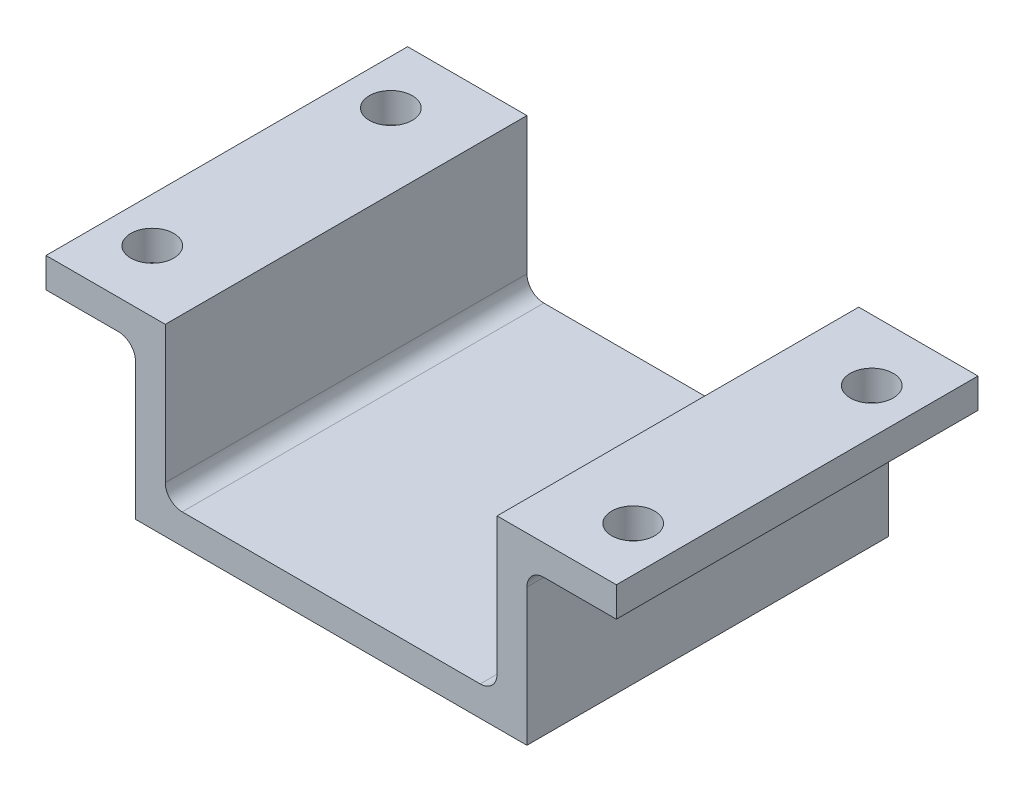
ISO-10303-21;
HEADER;
FILE_DESCRIPTION(('STEP AP214'),'2;1');
FILE_NAME('part.step','',(''),(''),'','','');
FILE_SCHEMA(('AUTOMOTIVE_DESIGN { 1 0 10303 214 1 1 1 1 }'));
ENDSEC;
DATA;
#1=APPLICATION_CONTEXT('core data for automotive mechanical design processes');
#2=APPLICATION_PROTOCOL_DEFINITION('international standard','automotive_design',2000,#1);
#3=PRODUCT_CONTEXT('',#1,'mechanical');
#4=PRODUCT('Part','Part','',(#3));
#5=PRODUCT_RELATED_PRODUCT_CATEGORY('part','',(#4));
#6=PRODUCT_DEFINITION_FORMATION('','',#4);
#7=PRODUCT_DEFINITION_CONTEXT('part definition',#1,'design');
#8=PRODUCT_DEFINITION('design','',#6,#7);
#9=PRODUCT_DEFINITION_SHAPE('','',#8);
#10=(LENGTH_UNIT() NAMED_UNIT(*) SI_UNIT(.MILLI.,.METRE.));
#11=(NAMED_UNIT(*) PLANE_ANGLE_UNIT() SI_UNIT($,.RADIAN.));
#12=(NAMED_UNIT(*) SI_UNIT($,.STERADIAN.) SOLID_ANGLE_UNIT());
#13=UNCERTAINTY_MEASURE_WITH_UNIT(LENGTH_MEASURE(1.E-05),#10,'distance_accuracy_value','');
#14=(GEOMETRIC_REPRESENTATION_CONTEXT(3) GLOBAL_UNCERTAINTY_ASSIGNED_CONTEXT((#13)) GLOBAL_UNIT_ASSIGNED_CONTEXT((#10,
#11,#12)) REPRESENTATION_CONTEXT('',''));
#15=CARTESIAN_POINT('',(0.,0.,0.));
#16=DIRECTION('',(0.,0.,1.));
#17=DIRECTION('',(1.,0.,0.));
#18=AXIS2_PLACEMENT_3D('',#15,#16,#17);
#19=CARTESIAN_POINT('',(0.,-1.27,19.250000108));
#20=DIRECTION('',(0.,1.,0.));
#21=DIRECTION('',(0.,0.,1.));
#22=AXIS2_PLACEMENT_3D('',#19,#20,#21);
#23=PLANE('',#22);
#24=CARTESIAN_POINT('',(-25.600000108,-1.27,12.7));
#25=DIRECTION('',(0.,1.,0.));
#26=DIRECTION('',(0.,0.,1.));
#27=AXIS2_PLACEMENT_3D('',#24,#25,#26);
#28=CIRCLE('',#27,2.286);
#29=CARTESIAN_POINT('',(-25.600000108,-1.27,14.986));
#30=VERTEX_POINT('',#29);
#31=EDGE_CURVE('E538',#30,#30,#28,.T.);
#32=ORIENTED_EDGE('',*,*,#31,.F.);
#33=EDGE_LOOP('',(#32));
#34=FACE_BOUND('',#33,.T.);
#35=CARTESIAN_POINT('',(-25.600000108,-1.27,-12.7));
#36=DIRECTION('',(0.,1.,0.));
#37=DIRECTION('',(0.,0.,1.));
#38=AXIS2_PLACEMENT_3D('',#35,#36,#37);
#39=CIRCLE('',#38,2.286);
#40=CARTESIAN_POINT('',(-25.600000108,-1.27,-10.414));
#41=VERTEX_POINT('',#40);
#42=EDGE_CURVE('E534',#41,#41,#39,.T.);
#43=ORIENTED_EDGE('',*,*,#42,.F.);
#44=EDGE_LOOP('',(#43));
#45=FACE_BOUND('',#44,.T.);
#46=DIRECTION('',(1.,0.,0.));
#47=VECTOR('',#46,1.);
#48=CARTESIAN_POINT('',(0.,-1.27,-19.250000108));
#49=LINE('',#48,#47);
#50=CARTESIAN_POINT('',(-30.362500108,-1.27,-19.250000108));
#51=VERTEX_POINT('',#50);
#52=CARTESIAN_POINT('',(-17.662500108,-1.27,-19.250000108));
#53=VERTEX_POINT('',#52);
#54=EDGE_CURVE('E151',#51,#53,#49,.T.);
#55=ORIENTED_EDGE('',*,*,#54,.F.);
#56=DIRECTION('',(0.,0.,-1.));
#57=VECTOR('',#56,1.);
#58=CARTESIAN_POINT('',(-30.362500108,-1.27,19.250000108));
#59=LINE('',#58,#57);
#60=CARTESIAN_POINT('',(-30.362500108,-1.27,19.250000108));
#61=VERTEX_POINT('',#60);
#62=EDGE_CURVE('E146',#61,#51,#59,.T.);
#63=ORIENTED_EDGE('',*,*,#62,.F.);
#64=DIRECTION('',(1.,0.,0.));
#65=VECTOR('',#64,1.);
#66=CARTESIAN_POINT('',(0.,-1.27,19.250000108));
#67=LINE('',#66,#65);
#68=CARTESIAN_POINT('',(-17.662500108,-1.27,19.250000108));
#69=VERTEX_POINT('',#68);
#70=EDGE_CURVE('E149',#61,#69,#67,.T.);
#71=ORIENTED_EDGE('',*,*,#70,.T.);
#72=DIRECTION('',(0.,0.,-1.));
#73=VECTOR('',#72,1.);
#74=CARTESIAN_POINT('',(-17.662500108,-1.27,19.250000108));
#75=LINE('',#74,#73);
#76=EDGE_CURVE('E197',#69,#53,#75,.T.);
#77=ORIENTED_EDGE('',*,*,#76,.T.);
#78=EDGE_LOOP('',(#55,#63,#71,#77));
#79=FACE_BOUND('',#78,.T.);
#80=ADVANCED_FACE('F35',(#34,#45,#79),#23,.T.);
#81=CARTESIAN_POINT('',(-30.362500108,0.,19.250000108));
#82=DIRECTION('',(-1.,0.,0.));
#83=DIRECTION('',(0.,0.,1.));
#84=AXIS2_PLACEMENT_3D('',#81,#82,#83);
#85=PLANE('',#84);
#86=DIRECTION('',(0.,1.,0.));
#87=VECTOR('',#86,1.);
#88=CARTESIAN_POINT('',(-30.362500108,0.,-19.250000108));
#89=LINE('',#88,#87);
#90=CARTESIAN_POINT('',(-30.362500108,-4.445,-19.250000108));
#91=VERTEX_POINT('',#90);
#92=EDGE_CURVE('E199',#91,#51,#89,.T.);
#93=ORIENTED_EDGE('',*,*,#92,.F.);
#94=DIRECTION('',(0.,0.,-1.));
#95=VECTOR('',#94,1.);
#96=CARTESIAN_POINT('',(-30.362500108,-4.445,19.250000108));
#97=LINE('',#96,#95);
#98=CARTESIAN_POINT('',(-30.362500108,-4.445,19.250000108));
#99=VERTEX_POINT('',#98);
#100=EDGE_CURVE('E157',#99,#91,#97,.T.);
#101=ORIENTED_EDGE('',*,*,#100,.F.);
#102=DIRECTION('',(0.,1.,0.));
#103=VECTOR('',#102,1.);
#104=CARTESIAN_POINT('',(-30.362500108,0.,19.250000108));
#105=LINE('',#104,#103);
#106=EDGE_CURVE('E162',#99,#61,#105,.T.);
#107=ORIENTED_EDGE('',*,*,#106,.T.);
#108=ORIENTED_EDGE('',*,*,#62,.T.);
#109=EDGE_LOOP('',(#93,#101,#107,#108));
#110=FACE_BOUND('',#109,.T.);
#111=ADVANCED_FACE('F169',(#110),#85,.T.);
#112=CARTESIAN_POINT('',(0.,-4.445,19.250000108));
#113=DIRECTION('',(0.,-1.,0.));
#114=DIRECTION('',(1.,0.,0.));
#115=AXIS2_PLACEMENT_3D('',#112,#113,#114);
#116=PLANE('',#115);
#117=CARTESIAN_POINT('',(-25.600000108,-4.445,12.7));
#118=DIRECTION('',(0.,-1.,0.));
#119=DIRECTION('',(1.,0.,0.));
#120=AXIS2_PLACEMENT_3D('',#117,#118,#119);
#121=CIRCLE('',#120,2.286);
#122=CARTESIAN_POINT('',(-23.314000108,-4.445,12.7));
#123=VERTEX_POINT('',#122);
#124=EDGE_CURVE('E200',#123,#123,#121,.T.);
#125=ORIENTED_EDGE('',*,*,#124,.F.);
#126=EDGE_LOOP('',(#125));
#127=FACE_BOUND('',#126,.T.);
#128=CARTESIAN_POINT('',(-25.600000108,-4.445,-12.7));
#129=DIRECTION('',(0.,-1.,0.));
#130=DIRECTION('',(1.,0.,0.));
#131=AXIS2_PLACEMENT_3D('',#128,#129,#130);
#132=CIRCLE('',#131,2.286);
#133=CARTESIAN_POINT('',(-23.314000108,-4.445,-12.7));
#134=VERTEX_POINT('',#133);
#135=EDGE_CURVE('E240',#134,#134,#132,.T.);
#136=ORIENTED_EDGE('',*,*,#135,.F.);
#137=EDGE_LOOP('',(#136));
#138=FACE_BOUND('',#137,.T.);
#139=DIRECTION('',(-1.,0.,0.));
#140=VECTOR('',#139,1.);
#141=CARTESIAN_POINT('',(0.,-4.445,-19.250000108));
#142=LINE('',#141,#140);
#143=CARTESIAN_POINT('',(-22.637500108,-4.445,-19.250000108));
#144=VERTEX_POINT('',#143);
#145=EDGE_CURVE('E202',#144,#91,#142,.T.);
#146=ORIENTED_EDGE('',*,*,#145,.F.);
#147=DIRECTION('',(0.,0.,-1.));
#148=VECTOR('',#147,1.);
#149=CARTESIAN_POINT('',(-22.637500108,-4.445,19.250000108));
#150=LINE('',#149,#148);
#151=CARTESIAN_POINT('',(-22.637500108,-4.445,19.250000108));
#152=VERTEX_POINT('',#151);
#153=EDGE_CURVE('E50',#144,#152,#150,.F.);
#154=ORIENTED_EDGE('',*,*,#153,.T.);
#155=DIRECTION('',(-1.,0.,0.));
#156=VECTOR('',#155,1.);
#157=CARTESIAN_POINT('',(0.,-4.445,19.250000108));
#158=LINE('',#157,#156);
#159=EDGE_CURVE('E171',#152,#99,#158,.T.);
#160=ORIENTED_EDGE('',*,*,#159,.T.);
#161=ORIENTED_EDGE('',*,*,#100,.T.);
#162=EDGE_LOOP('',(#146,#154,#160,#161));
#163=FACE_BOUND('',#162,.T.);
#164=ADVANCED_FACE('F304',(#127,#138,#163),#116,.T.);
#165=CARTESIAN_POINT('',(-20.837500108,0.,19.250000108));
#166=DIRECTION('',(-1.,0.,0.));
#167=DIRECTION('',(0.,0.,1.));
#168=AXIS2_PLACEMENT_3D('',#165,#166,#167);
#169=PLANE('',#168);
#170=DIRECTION('',(0.,1.,0.));
#171=VECTOR('',#170,1.);
#172=CARTESIAN_POINT('',(-20.837500108,0.,19.250000108));
#173=LINE('',#172,#171);
#174=CARTESIAN_POINT('',(-20.837500108,-20.837500108,19.250000108));
#175=VERTEX_POINT('',#174);
#176=CARTESIAN_POINT('',(-20.837500108,-6.245,19.250000108));
#177=VERTEX_POINT('',#176);
#178=EDGE_CURVE('E173',#175,#177,#173,.T.);
#179=ORIENTED_EDGE('',*,*,#178,.T.);
#180=DIRECTION('',(0.,0.,-1.));
#181=VECTOR('',#180,1.);
#182=CARTESIAN_POINT('',(-20.837500108,-6.245,-19.250000108));
#183=LINE('',#182,#181);
#184=CARTESIAN_POINT('',(-20.837500108,-6.245,-19.250000108));
#185=VERTEX_POINT('',#184);
#186=EDGE_CURVE('E260',#177,#185,#183,.T.);
#187=ORIENTED_EDGE('',*,*,#186,.T.);
#188=DIRECTION('',(0.,1.,0.));
#189=VECTOR('',#188,1.);
#190=CARTESIAN_POINT('',(-20.837500108,0.,-19.250000108));
#191=LINE('',#190,#189);
#192=CARTESIAN_POINT('',(-20.837500108,-20.837500108,-19.250000108));
#193=VERTEX_POINT('',#192);
#194=EDGE_CURVE('E204',#193,#185,#191,.T.);
#195=ORIENTED_EDGE('',*,*,#194,.F.);
#196=DIRECTION('',(0.,0.,-1.));
#197=VECTOR('',#196,1.);
#198=CARTESIAN_POINT('',(-20.837500108,-20.837500108,19.250000108));
#199=LINE('',#198,#197);
#200=EDGE_CURVE('E237',#175,#193,#199,.T.);
#201=ORIENTED_EDGE('',*,*,#200,.F.);
#202=EDGE_LOOP('',(#179,#187,#195,#201));
#203=FACE_BOUND('',#202,.T.);
#204=ADVANCED_FACE('F300',(#203),#169,.T.);
#205=CARTESIAN_POINT('',(0.,-20.837500108,19.250000108));
#206=DIRECTION('',(0.,1.,0.));
#207=DIRECTION('',(0.,0.,1.));
#208=AXIS2_PLACEMENT_3D('',#205,#206,#207);
#209=PLANE('',#208);
#210=DIRECTION('',(1.,0.,0.));
#211=VECTOR('',#210,1.);
#212=CARTESIAN_POINT('',(0.,-20.837500108,-19.250000108));
#213=LINE('',#212,#211);
#214=CARTESIAN_POINT('',(20.837500108,-20.837500108,-19.250000108));
#215=VERTEX_POINT('',#214);
#216=EDGE_CURVE('E206',#193,#215,#213,.T.);
#217=ORIENTED_EDGE('',*,*,#216,.T.);
#218=DIRECTION('',(0.,0.,-1.));
#219=VECTOR('',#218,1.);
#220=CARTESIAN_POINT('',(20.837500108,-20.837500108,19.250000108));
#221=LINE('',#220,#219);
#222=CARTESIAN_POINT('',(20.837500108,-20.837500108,19.250000108));
#223=VERTEX_POINT('',#222);
#224=EDGE_CURVE('E234',#223,#215,#221,.T.);
#225=ORIENTED_EDGE('',*,*,#224,.F.);
#226=DIRECTION('',(1.,0.,0.));
#227=VECTOR('',#226,1.);
#228=CARTESIAN_POINT('',(0.,-20.837500108,19.250000108));
#229=LINE('',#228,#227);
#230=EDGE_CURVE('E179',#175,#223,#229,.T.);
#231=ORIENTED_EDGE('',*,*,#230,.F.);
#232=ORIENTED_EDGE('',*,*,#200,.T.);
#233=EDGE_LOOP('',(#217,#225,#231,#232));
#234=FACE_BOUND('',#233,.T.);
#235=ADVANCED_FACE('F296',(#234),#209,.F.);
#236=CARTESIAN_POINT('',(20.837500108,0.,19.250000108));
#237=DIRECTION('',(-1.,0.,0.));
#238=DIRECTION('',(0.,0.,1.));
#239=AXIS2_PLACEMENT_3D('',#236,#237,#238);
#240=PLANE('',#239);
#241=DIRECTION('',(0.,1.,0.));
#242=VECTOR('',#241,1.);
#243=CARTESIAN_POINT('',(20.837500108,0.,-19.250000108));
#244=LINE('',#243,#242);
#245=CARTESIAN_POINT('',(20.837500108,-6.245,-19.250000108));
#246=VERTEX_POINT('',#245);
#247=EDGE_CURVE('E208',#215,#246,#244,.T.);
#248=ORIENTED_EDGE('',*,*,#247,.T.);
#249=DIRECTION('',(0.,0.,-1.));
#250=VECTOR('',#249,1.);
#251=CARTESIAN_POINT('',(20.837500108,-6.245,19.250000108));
#252=LINE('',#251,#250);
#253=CARTESIAN_POINT('',(20.837500108,-6.245,19.250000108));
#254=VERTEX_POINT('',#253);
#255=EDGE_CURVE('E258',#246,#254,#252,.F.);
#256=ORIENTED_EDGE('',*,*,#255,.T.);
#257=DIRECTION('',(0.,1.,0.));
#258=VECTOR('',#257,1.);
#259=CARTESIAN_POINT('',(20.837500108,0.,19.250000108));
#260=LINE('',#259,#258);
#261=EDGE_CURVE('E181',#223,#254,#260,.T.);
#262=ORIENTED_EDGE('',*,*,#261,.F.);
#263=ORIENTED_EDGE('',*,*,#224,.T.);
#264=EDGE_LOOP('',(#248,#256,#262,#263));
#265=FACE_BOUND('',#264,.T.);
#266=ADVANCED_FACE('F292',(#265),#240,.F.);
#267=CARTESIAN_POINT('',(0.,-4.445,19.250000108));
#268=DIRECTION('',(0.,1.,0.));
#269=DIRECTION('',(-1.,0.,0.));
#270=AXIS2_PLACEMENT_3D('',#267,#268,#269);
#271=PLANE('',#270);
#272=CARTESIAN_POINT('',(25.600000108,-4.445,-12.7));
#273=DIRECTION('',(0.,1.,0.));
#274=DIRECTION('',(-1.,0.,0.));
#275=AXIS2_PLACEMENT_3D('',#272,#273,#274);
#276=CIRCLE('',#275,2.286);
#277=CARTESIAN_POINT('',(23.314000108,-4.445,-12.7));
#278=VERTEX_POINT('',#277);
#279=EDGE_CURVE('E243',#278,#278,#276,.T.);
#280=ORIENTED_EDGE('',*,*,#279,.T.);
#281=EDGE_LOOP('',(#280));
#282=FACE_BOUND('',#281,.T.);
#283=CARTESIAN_POINT('',(25.600000108,-4.445,12.7));
#284=DIRECTION('',(0.,1.,0.));
#285=DIRECTION('',(-1.,0.,0.));
#286=AXIS2_PLACEMENT_3D('',#283,#284,#285);
#287=CIRCLE('',#286,2.286);
#288=CARTESIAN_POINT('',(23.314000108,-4.445,12.7));
#289=VERTEX_POINT('',#288);
#290=EDGE_CURVE('E532',#289,#289,#287,.T.);
#291=ORIENTED_EDGE('',*,*,#290,.T.);
#292=EDGE_LOOP('',(#291));
#293=FACE_BOUND('',#292,.T.);
#294=DIRECTION('',(1.,0.,0.));
#295=VECTOR('',#294,1.);
#296=CARTESIAN_POINT('',(0.,-4.445,19.250000108));
#297=LINE('',#296,#295);
#298=CARTESIAN_POINT('',(22.637500108,-4.445,19.250000108));
#299=VERTEX_POINT('',#298);
#300=CARTESIAN_POINT('',(30.362500108,-4.445,19.250000108));
#301=VERTEX_POINT('',#300);
#302=EDGE_CURVE('E184',#299,#301,#297,.T.);
#303=ORIENTED_EDGE('',*,*,#302,.F.);
#304=DIRECTION('',(0.,0.,-1.));
#305=VECTOR('',#304,1.);
#306=CARTESIAN_POINT('',(22.637500108,-4.445,-19.250000108));
#307=LINE('',#306,#305);
#308=CARTESIAN_POINT('',(22.637500108,-4.445,-19.250000108));
#309=VERTEX_POINT('',#308);
#310=EDGE_CURVE('E255',#299,#309,#307,.T.);
#311=ORIENTED_EDGE('',*,*,#310,.T.);
#312=DIRECTION('',(1.,0.,0.));
#313=VECTOR('',#312,1.);
#314=CARTESIAN_POINT('',(0.,-4.445,-19.250000108));
#315=LINE('',#314,#313);
#316=CARTESIAN_POINT('',(30.362500108,-4.445,-19.250000108));
#317=VERTEX_POINT('',#316);
#318=EDGE_CURVE('E211',#309,#317,#315,.T.);
#319=ORIENTED_EDGE('',*,*,#318,.T.);
#320=DIRECTION('',(0.,0.,-1.));
#321=VECTOR('',#320,1.);
#322=CARTESIAN_POINT('',(30.362500108,-4.445,19.250000108));
#323=LINE('',#322,#321);
#324=EDGE_CURVE('E231',#301,#317,#323,.T.);
#325=ORIENTED_EDGE('',*,*,#324,.F.);
#326=EDGE_LOOP('',(#303,#311,#319,#325));
#327=FACE_BOUND('',#326,.T.);
#328=ADVANCED_FACE('F283',(#282,#293,#327),#271,.F.);
#329=CARTESIAN_POINT('',(30.362500108,0.,19.250000108));
#330=DIRECTION('',(-1.,0.,0.));
#331=DIRECTION('',(0.,0.,1.));
#332=AXIS2_PLACEMENT_3D('',#329,#330,#331);
#333=PLANE('',#332);
#334=DIRECTION('',(0.,1.,0.));
#335=VECTOR('',#334,1.);
#336=CARTESIAN_POINT('',(30.362500108,0.,-19.250000108));
#337=LINE('',#336,#335);
#338=CARTESIAN_POINT('',(30.362500108,-1.27,-19.250000108));
#339=VERTEX_POINT('',#338);
#340=EDGE_CURVE('E213',#317,#339,#337,.T.);
#341=ORIENTED_EDGE('',*,*,#340,.T.);
#342=DIRECTION('',(0.,0.,-1.));
#343=VECTOR('',#342,1.);
#344=CARTESIAN_POINT('',(30.362500108,-1.27,19.250000108));
#345=LINE('',#344,#343);
#346=CARTESIAN_POINT('',(30.362500108,-1.27,19.250000108));
#347=VERTEX_POINT('',#346);
#348=EDGE_CURVE('E228',#347,#339,#345,.T.);
#349=ORIENTED_EDGE('',*,*,#348,.F.);
#350=DIRECTION('',(0.,1.,0.));
#351=VECTOR('',#350,1.);
#352=CARTESIAN_POINT('',(30.362500108,0.,19.250000108));
#353=LINE('',#352,#351);
#354=EDGE_CURVE('E186',#301,#347,#353,.T.);
#355=ORIENTED_EDGE('',*,*,#354,.F.);
#356=ORIENTED_EDGE('',*,*,#324,.T.);
#357=EDGE_LOOP('',(#341,#349,#355,#356));
#358=FACE_BOUND('',#357,.T.);
#359=ADVANCED_FACE('F333',(#358),#333,.F.);
#360=CARTESIAN_POINT('',(0.,-1.27,19.250000108));
#361=DIRECTION('',(0.,-1.,0.));
#362=DIRECTION('',(0.,0.,-1.));
#363=AXIS2_PLACEMENT_3D('',#360,#361,#362);
#364=PLANE('',#363);
#365=CARTESIAN_POINT('',(25.600000108,-1.27,-12.7));
#366=DIRECTION('',(0.,1.,0.));
#367=DIRECTION('',(0.,0.,1.));
#368=AXIS2_PLACEMENT_3D('',#365,#366,#367);
#369=CIRCLE('',#368,2.286);
#370=CARTESIAN_POINT('',(25.600000108,-1.27,-10.414));
#371=VERTEX_POINT('',#370);
#372=EDGE_CURVE('E541',#371,#371,#369,.T.);
#373=ORIENTED_EDGE('',*,*,#372,.F.);
#374=EDGE_LOOP('',(#373));
#375=FACE_BOUND('',#374,.T.);
#376=CARTESIAN_POINT('',(25.600000108,-1.27,12.7));
#377=DIRECTION('',(0.,1.,0.));
#378=DIRECTION('',(0.,0.,1.));
#379=AXIS2_PLACEMENT_3D('',#376,#377,#378);
#380=CIRCLE('',#379,2.286);
#381=CARTESIAN_POINT('',(25.600000108,-1.27,14.986));
#382=VERTEX_POINT('',#381);
#383=EDGE_CURVE('E529',#382,#382,#380,.T.);
#384=ORIENTED_EDGE('',*,*,#383,.F.);
#385=EDGE_LOOP('',(#384));
#386=FACE_BOUND('',#385,.T.);
#387=DIRECTION('',(-1.,0.,0.));
#388=VECTOR('',#387,1.);
#389=CARTESIAN_POINT('',(0.,-1.27,-19.250000108));
#390=LINE('',#389,#388);
#391=CARTESIAN_POINT('',(17.662500108,-1.27,-19.250000108));
#392=VERTEX_POINT('',#391);
#393=EDGE_CURVE('E215',#339,#392,#390,.T.);
#394=ORIENTED_EDGE('',*,*,#393,.T.);
#395=DIRECTION('',(0.,0.,-1.));
#396=VECTOR('',#395,1.);
#397=CARTESIAN_POINT('',(17.662500108,-1.27,19.250000108));
#398=LINE('',#397,#396);
#399=CARTESIAN_POINT('',(17.662500108,-1.27,19.250000108));
#400=VERTEX_POINT('',#399);
#401=EDGE_CURVE('E225',#400,#392,#398,.T.);
#402=ORIENTED_EDGE('',*,*,#401,.F.);
#403=DIRECTION('',(-1.,0.,0.));
#404=VECTOR('',#403,1.);
#405=CARTESIAN_POINT('',(0.,-1.27,19.250000108));
#406=LINE('',#405,#404);
#407=EDGE_CURVE('E188',#347,#400,#406,.T.);
#408=ORIENTED_EDGE('',*,*,#407,.F.);
#409=ORIENTED_EDGE('',*,*,#348,.T.);
#410=EDGE_LOOP('',(#394,#402,#408,#409));
#411=FACE_BOUND('',#410,.T.);
#412=ADVANCED_FACE('F330',(#375,#386,#411),#364,.F.);
#413=CARTESIAN_POINT('',(17.662500108,0.,19.250000108));
#414=DIRECTION('',(-1.,0.,0.));
#415=DIRECTION('',(0.,0.,1.));
#416=AXIS2_PLACEMENT_3D('',#413,#414,#415);
#417=PLANE('',#416);
#418=DIRECTION('',(0.,1.,0.));
#419=VECTOR('',#418,1.);
#420=CARTESIAN_POINT('',(17.662500108,0.,-19.250000108));
#421=LINE('',#420,#419);
#422=CARTESIAN_POINT('',(17.662500108,-15.862500108,-19.250000108));
#423=VERTEX_POINT('',#422);
#424=EDGE_CURVE('E218',#423,#392,#421,.T.);
#425=ORIENTED_EDGE('',*,*,#424,.F.);
#426=DIRECTION('',(0.,0.,-1.));
#427=VECTOR('',#426,1.);
#428=CARTESIAN_POINT('',(17.662500108,-15.862500108,19.250000108));
#429=LINE('',#428,#427);
#430=CARTESIAN_POINT('',(17.662500108,-15.862500108,19.250000108));
#431=VERTEX_POINT('',#430);
#432=EDGE_CURVE('E253',#423,#431,#429,.F.);
#433=ORIENTED_EDGE('',*,*,#432,.T.);
#434=DIRECTION('',(0.,1.,0.));
#435=VECTOR('',#434,1.);
#436=CARTESIAN_POINT('',(17.662500108,0.,19.250000108));
#437=LINE('',#436,#435);
#438=EDGE_CURVE('E191',#431,#400,#437,.T.);
#439=ORIENTED_EDGE('',*,*,#438,.T.);
#440=ORIENTED_EDGE('',*,*,#401,.T.);
#441=EDGE_LOOP('',(#425,#433,#439,#440));
#442=FACE_BOUND('',#441,.T.);
#443=ADVANCED_FACE('F326',(#442),#417,.T.);
#444=CARTESIAN_POINT('',(0.,-17.662500108,19.250000108));
#445=DIRECTION('',(0.,1.,0.));
#446=DIRECTION('',(0.,0.,1.));
#447=AXIS2_PLACEMENT_3D('',#444,#445,#446);
#448=PLANE('',#447);
#449=DIRECTION('',(1.,0.,0.));
#450=VECTOR('',#449,1.);
#451=CARTESIAN_POINT('',(0.,-17.662500108,-19.250000108));
#452=LINE('',#451,#450);
#453=CARTESIAN_POINT('',(-15.862500108,-17.662500108,-19.250000108));
#454=VERTEX_POINT('',#453);
#455=CARTESIAN_POINT('',(15.862500108,-17.662500108,-19.250000108));
#456=VERTEX_POINT('',#455);
#457=EDGE_CURVE('E220',#454,#456,#452,.T.);
#458=ORIENTED_EDGE('',*,*,#457,.F.);
#459=DIRECTION('',(0.,0.,-1.));
#460=VECTOR('',#459,1.);
#461=CARTESIAN_POINT('',(-15.862500108,-17.662500108,19.250000108));
#462=LINE('',#461,#460);
#463=CARTESIAN_POINT('',(-15.862500108,-17.662500108,19.250000108));
#464=VERTEX_POINT('',#463);
#465=EDGE_CURVE('E251',#454,#464,#462,.F.);
#466=ORIENTED_EDGE('',*,*,#465,.T.);
#467=DIRECTION('',(1.,0.,0.));
#468=VECTOR('',#467,1.);
#469=CARTESIAN_POINT('',(0.,-17.662500108,19.250000108));
#470=LINE('',#469,#468);
#471=CARTESIAN_POINT('',(15.862500108,-17.662500108,19.250000108));
#472=VERTEX_POINT('',#471);
#473=EDGE_CURVE('E193',#464,#472,#470,.T.);
#474=ORIENTED_EDGE('',*,*,#473,.T.);
#475=DIRECTION('',(0.,0.,-1.));
#476=VECTOR('',#475,1.);
#477=CARTESIAN_POINT('',(15.862500108,-17.662500108,-19.250000108));
#478=LINE('',#477,#476);
#479=EDGE_CURVE('E248',#472,#456,#478,.T.);
#480=ORIENTED_EDGE('',*,*,#479,.T.);
#481=EDGE_LOOP('',(#458,#466,#474,#480));
#482=FACE_BOUND('',#481,.T.);
#483=ADVANCED_FACE('F316',(#482),#448,.T.);
#484=CARTESIAN_POINT('',(-17.662500108,0.,19.250000108));
#485=DIRECTION('',(-1.,0.,0.));
#486=DIRECTION('',(0.,0.,1.));
#487=AXIS2_PLACEMENT_3D('',#484,#485,#486);
#488=PLANE('',#487);
#489=DIRECTION('',(0.,1.,0.));
#490=VECTOR('',#489,1.);
#491=CARTESIAN_POINT('',(-17.662500108,0.,19.250000108));
#492=LINE('',#491,#490);
#493=CARTESIAN_POINT('',(-17.662500108,-15.862500108,19.250000108));
#494=VERTEX_POINT('',#493);
#495=EDGE_CURVE('E164',#494,#69,#492,.T.);
#496=ORIENTED_EDGE('',*,*,#495,.F.);
#497=DIRECTION('',(0.,0.,-1.));
#498=VECTOR('',#497,1.);
#499=CARTESIAN_POINT('',(-17.662500108,-15.862500108,19.250000108));
#500=LINE('',#499,#498);
#501=CARTESIAN_POINT('',(-17.662500108,-15.862500108,-19.250000108));
#502=VERTEX_POINT('',#501);
#503=EDGE_CURVE('E156',#494,#502,#500,.T.);
#504=ORIENTED_EDGE('',*,*,#503,.T.);
#505=DIRECTION('',(0.,1.,0.));
#506=VECTOR('',#505,1.);
#507=CARTESIAN_POINT('',(-17.662500108,0.,-19.250000108));
#508=LINE('',#507,#506);
#509=EDGE_CURVE('E166',#502,#53,#508,.T.);
#510=ORIENTED_EDGE('',*,*,#509,.T.);
#511=ORIENTED_EDGE('',*,*,#76,.F.);
#512=EDGE_LOOP('',(#496,#504,#510,#511));
#513=FACE_BOUND('',#512,.T.);
#514=ADVANCED_FACE('F308',(#513),#488,.F.);
#515=CARTESIAN_POINT('',(0.,0.,19.250000108));
#516=DIRECTION('',(0.,0.,1.));
#517=DIRECTION('',(1.,0.,0.));
#518=AXIS2_PLACEMENT_3D('',#515,#516,#517);
#519=PLANE('',#518);
#520=ORIENTED_EDGE('',*,*,#70,.F.);
#521=ORIENTED_EDGE('',*,*,#106,.F.);
#522=ORIENTED_EDGE('',*,*,#159,.F.);
#523=CARTESIAN_POINT('',(-22.637500108,-6.245,19.250000108));
#524=DIRECTION('',(0.,0.,1.));
#525=DIRECTION('',(1.,0.,0.));
#526=AXIS2_PLACEMENT_3D('',#523,#524,#525);
#527=CIRCLE('',#526,1.8);
#528=EDGE_CURVE('E11',#152,#177,#527,.F.);
#529=ORIENTED_EDGE('',*,*,#528,.T.);
#530=ORIENTED_EDGE('',*,*,#178,.F.);
#531=ORIENTED_EDGE('',*,*,#230,.T.);
#532=ORIENTED_EDGE('',*,*,#261,.T.);
#533=CARTESIAN_POINT('',(22.637500108,-6.245,19.250000108));
#534=DIRECTION('',(0.,0.,1.));
#535=DIRECTION('',(1.,0.,0.));
#536=AXIS2_PLACEMENT_3D('',#533,#534,#535);
#537=CIRCLE('',#536,1.8);
#538=EDGE_CURVE('E274',#254,#299,#537,.F.);
#539=ORIENTED_EDGE('',*,*,#538,.T.);
#540=ORIENTED_EDGE('',*,*,#302,.T.);
#541=ORIENTED_EDGE('',*,*,#354,.T.);
#542=ORIENTED_EDGE('',*,*,#407,.T.);
#543=ORIENTED_EDGE('',*,*,#438,.F.);
#544=CARTESIAN_POINT('',(15.862500108,-15.862500108,19.250000108));
#545=DIRECTION('',(0.,0.,1.));
#546=DIRECTION('',(1.,0.,0.));
#547=AXIS2_PLACEMENT_3D('',#544,#545,#546);
#548=CIRCLE('',#547,1.8);
#549=EDGE_CURVE('E270',#431,#472,#548,.F.);
#550=ORIENTED_EDGE('',*,*,#549,.T.);
#551=ORIENTED_EDGE('',*,*,#473,.F.);
#552=CARTESIAN_POINT('',(-15.862500108,-15.862500108,19.250000108));
#553=DIRECTION('',(0.,0.,1.));
#554=DIRECTION('',(1.,0.,0.));
#555=AXIS2_PLACEMENT_3D('',#552,#553,#554);
#556=CIRCLE('',#555,1.8);
#557=EDGE_CURVE('E266',#464,#494,#556,.F.);
#558=ORIENTED_EDGE('',*,*,#557,.T.);
#559=ORIENTED_EDGE('',*,*,#495,.T.);
#560=EDGE_LOOP('',(#520,#521,#522,#529,#530,#531,#532,#539,#540,#541,#542,#543,#550,#551,#558,#559));
#561=FACE_BOUND('',#560,.T.);
#562=ADVANCED_FACE('F161',(#561),#519,.T.);
#563=CARTESIAN_POINT('',(0.,0.,-19.250000108));
#564=DIRECTION('',(0.,0.,1.));
#565=DIRECTION('',(1.,0.,0.));
#566=AXIS2_PLACEMENT_3D('',#563,#564,#565);
#567=PLANE('',#566);
#568=ORIENTED_EDGE('',*,*,#54,.T.);
#569=ORIENTED_EDGE('',*,*,#509,.F.);
#570=CARTESIAN_POINT('',(-15.862500108,-15.862500108,-19.250000108));
#571=DIRECTION('',(0.,0.,1.));
#572=DIRECTION('',(1.,0.,0.));
#573=AXIS2_PLACEMENT_3D('',#570,#571,#572);
#574=CIRCLE('',#573,1.8);
#575=EDGE_CURVE('E264',#502,#454,#574,.T.);
#576=ORIENTED_EDGE('',*,*,#575,.T.);
#577=ORIENTED_EDGE('',*,*,#457,.T.);
#578=CARTESIAN_POINT('',(15.862500108,-15.862500108,-19.250000108));
#579=DIRECTION('',(0.,0.,1.));
#580=DIRECTION('',(1.,0.,0.));
#581=AXIS2_PLACEMENT_3D('',#578,#579,#580);
#582=CIRCLE('',#581,1.8);
#583=EDGE_CURVE('E268',#456,#423,#582,.T.);
#584=ORIENTED_EDGE('',*,*,#583,.T.);
#585=ORIENTED_EDGE('',*,*,#424,.T.);
#586=ORIENTED_EDGE('',*,*,#393,.F.);
#587=ORIENTED_EDGE('',*,*,#340,.F.);
#588=ORIENTED_EDGE('',*,*,#318,.F.);
#589=CARTESIAN_POINT('',(22.637500108,-6.245,-19.250000108));
#590=DIRECTION('',(0.,0.,1.));
#591=DIRECTION('',(1.,0.,0.));
#592=AXIS2_PLACEMENT_3D('',#589,#590,#591);
#593=CIRCLE('',#592,1.8);
#594=EDGE_CURVE('E272',#309,#246,#593,.T.);
#595=ORIENTED_EDGE('',*,*,#594,.T.);
#596=ORIENTED_EDGE('',*,*,#247,.F.);
#597=ORIENTED_EDGE('',*,*,#216,.F.);
#598=ORIENTED_EDGE('',*,*,#194,.T.);
#599=CARTESIAN_POINT('',(-22.637500108,-6.245,-19.250000108));
#600=DIRECTION('',(0.,0.,1.));
#601=DIRECTION('',(1.,0.,0.));
#602=AXIS2_PLACEMENT_3D('',#599,#600,#601);
#603=CIRCLE('',#602,1.8);
#604=EDGE_CURVE('E43',#185,#144,#603,.T.);
#605=ORIENTED_EDGE('',*,*,#604,.T.);
#606=ORIENTED_EDGE('',*,*,#145,.T.);
#607=ORIENTED_EDGE('',*,*,#92,.T.);
#608=EDGE_LOOP('',(#568,#569,#576,#577,#584,#585,#586,#587,#588,#595,#596,#597,#598,#605,#606,#607));
#609=FACE_BOUND('',#608,.T.);
#610=ADVANCED_FACE('F288',(#609),#567,.F.);
#611=CARTESIAN_POINT('',(25.600000108,-20.837500108,12.7));
#612=DIRECTION('',(0.,1.,0.));
#613=DIRECTION('',(0.,0.,1.));
#614=AXIS2_PLACEMENT_3D('',#611,#612,#613);
#615=CYLINDRICAL_SURFACE('',#614,2.286);
#616=ORIENTED_EDGE('',*,*,#383,.T.);
#617=EDGE_LOOP('',(#616));
#618=FACE_BOUND('',#617,.T.);
#619=ORIENTED_EDGE('',*,*,#290,.F.);
#620=EDGE_LOOP('',(#619));
#621=FACE_BOUND('',#620,.T.);
#622=ADVANCED_FACE('F392',(#618,#621),#615,.F.);
#623=CARTESIAN_POINT('',(25.600000108,-20.837500108,-12.7));
#624=DIRECTION('',(0.,1.,0.));
#625=DIRECTION('',(0.,0.,1.));
#626=AXIS2_PLACEMENT_3D('',#623,#624,#625);
#627=CYLINDRICAL_SURFACE('',#626,2.286);
#628=ORIENTED_EDGE('',*,*,#372,.T.);
#629=EDGE_LOOP('',(#628));
#630=FACE_BOUND('',#629,.T.);
#631=ORIENTED_EDGE('',*,*,#279,.F.);
#632=EDGE_LOOP('',(#631));
#633=FACE_BOUND('',#632,.T.);
#634=ADVANCED_FACE('F482',(#630,#633),#627,.F.);
#635=CARTESIAN_POINT('',(-25.600000108,-20.837500108,-12.7));
#636=DIRECTION('',(0.,1.,0.));
#637=DIRECTION('',(0.,0.,1.));
#638=AXIS2_PLACEMENT_3D('',#635,#636,#637);
#639=CYLINDRICAL_SURFACE('',#638,2.286);
#640=ORIENTED_EDGE('',*,*,#135,.T.);
#641=EDGE_LOOP('',(#640));
#642=FACE_BOUND('',#641,.T.);
#643=ORIENTED_EDGE('',*,*,#42,.T.);
#644=EDGE_LOOP('',(#643));
#645=FACE_BOUND('',#644,.T.);
#646=ADVANCED_FACE('F472',(#642,#645),#639,.F.);
#647=CARTESIAN_POINT('',(-25.600000108,-20.837500108,12.7));
#648=DIRECTION('',(0.,1.,0.));
#649=DIRECTION('',(0.,0.,1.));
#650=AXIS2_PLACEMENT_3D('',#647,#648,#649);
#651=CYLINDRICAL_SURFACE('',#650,2.286);
#652=ORIENTED_EDGE('',*,*,#124,.T.);
#653=EDGE_LOOP('',(#652));
#654=FACE_BOUND('',#653,.T.);
#655=ORIENTED_EDGE('',*,*,#31,.T.);
#656=EDGE_LOOP('',(#655));
#657=FACE_BOUND('',#656,.T.);
#658=ADVANCED_FACE('F357',(#654,#657),#651,.F.);
#659=CARTESIAN_POINT('',(-15.862500108,-15.862500108,19.250000108));
#660=DIRECTION('',(0.,0.,-1.));
#661=DIRECTION('',(-1.,0.,0.));
#662=AXIS2_PLACEMENT_3D('',#659,#660,#661);
#663=CYLINDRICAL_SURFACE('',#662,1.8);
#664=ORIENTED_EDGE('',*,*,#557,.F.);
#665=ORIENTED_EDGE('',*,*,#465,.F.);
#666=ORIENTED_EDGE('',*,*,#575,.F.);
#667=ORIENTED_EDGE('',*,*,#503,.F.);
#668=EDGE_LOOP('',(#664,#665,#666,#667));
#669=FACE_BOUND('',#668,.T.);
#670=ADVANCED_FACE('F312',(#669),#663,.F.);
#671=CARTESIAN_POINT('',(15.862500108,-15.862500108,19.250000108));
#672=DIRECTION('',(0.,0.,1.));
#673=DIRECTION('',(1.,0.,0.));
#674=AXIS2_PLACEMENT_3D('',#671,#672,#673);
#675=CYLINDRICAL_SURFACE('',#674,1.8);
#676=ORIENTED_EDGE('',*,*,#549,.F.);
#677=ORIENTED_EDGE('',*,*,#432,.F.);
#678=ORIENTED_EDGE('',*,*,#583,.F.);
#679=ORIENTED_EDGE('',*,*,#479,.F.);
#680=EDGE_LOOP('',(#676,#677,#678,#679));
#681=FACE_BOUND('',#680,.T.);
#682=ADVANCED_FACE('F322',(#681),#675,.F.);
#683=CARTESIAN_POINT('',(22.637500108,-6.245,19.250000108));
#684=DIRECTION('',(0.,0.,1.));
#685=DIRECTION('',(1.,0.,0.));
#686=AXIS2_PLACEMENT_3D('',#683,#684,#685);
#687=CYLINDRICAL_SURFACE('',#686,1.8);
#688=ORIENTED_EDGE('',*,*,#538,.F.);
#689=ORIENTED_EDGE('',*,*,#255,.F.);
#690=ORIENTED_EDGE('',*,*,#594,.F.);
#691=ORIENTED_EDGE('',*,*,#310,.F.);
#692=EDGE_LOOP('',(#688,#689,#690,#691));
#693=FACE_BOUND('',#692,.T.);
#694=ADVANCED_FACE('F286',(#693),#687,.F.);
#695=CARTESIAN_POINT('',(-22.637500108,-6.245,19.250000108));
#696=DIRECTION('',(0.,0.,1.));
#697=DIRECTION('',(1.,0.,0.));
#698=AXIS2_PLACEMENT_3D('',#695,#696,#697);
#699=CYLINDRICAL_SURFACE('',#698,1.8);
#700=ORIENTED_EDGE('',*,*,#528,.F.);
#701=ORIENTED_EDGE('',*,*,#153,.F.);
#702=ORIENTED_EDGE('',*,*,#604,.F.);
#703=ORIENTED_EDGE('',*,*,#186,.F.);
#704=EDGE_LOOP('',(#700,#701,#702,#703));
#705=FACE_BOUND('',#704,.T.);
#706=ADVANCED_FACE('F37',(#705),#699,.F.);
#707=CLOSED_SHELL('',(#80,#111,#164,#204,#235,#266,#328,#359,#412,#443,#483,#514,#562,#610,#622,
#634,#646,#658,#670,#682,#694,#706));
#708=MANIFOLD_SOLID_BREP('B2',#707);
#709=ADVANCED_BREP_SHAPE_REPRESENTATION('',(#18,#708),#14);
#710=SHAPE_DEFINITION_REPRESENTATION(#9,#709);
ENDSEC;
END-ISO-10303-21;
